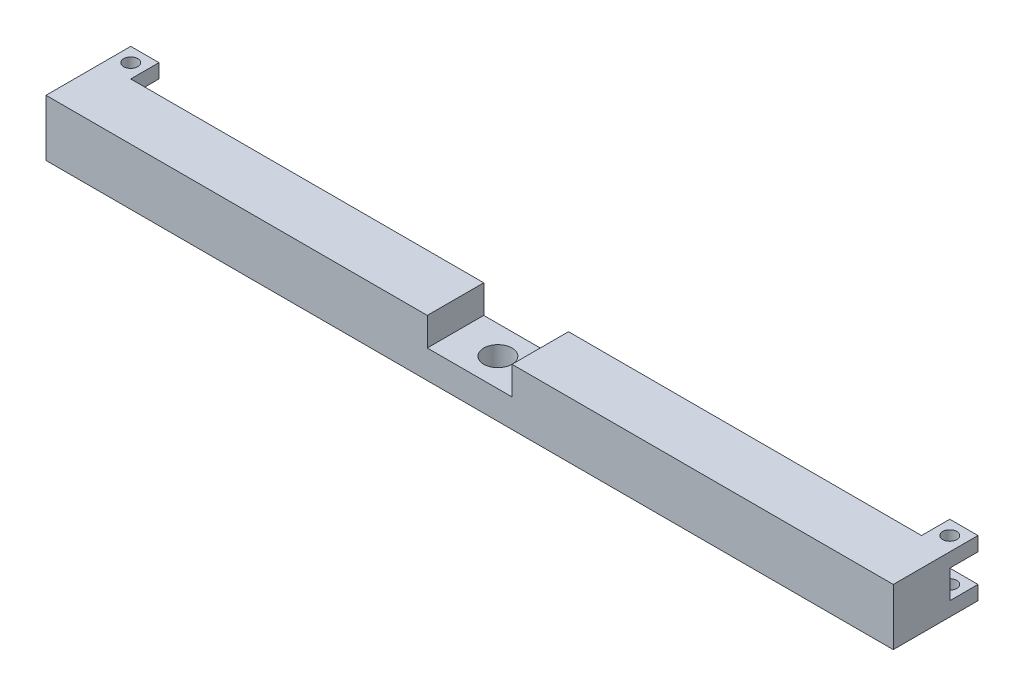
ISO-10303-21;
HEADER;
FILE_DESCRIPTION(('STEP AP214'),'2;1');
FILE_NAME('part.step','',(''),(''),'','','');
FILE_SCHEMA(('AUTOMOTIVE_DESIGN { 1 0 10303 214 1 1 1 1 }'));
ENDSEC;
DATA;
#1=APPLICATION_CONTEXT('core data for automotive mechanical design processes');
#2=APPLICATION_PROTOCOL_DEFINITION('international standard','automotive_design',2000,#1);
#3=PRODUCT_CONTEXT('',#1,'mechanical');
#4=PRODUCT('Part','Part','',(#3));
#5=PRODUCT_RELATED_PRODUCT_CATEGORY('part','',(#4));
#6=PRODUCT_DEFINITION_FORMATION('','',#4);
#7=PRODUCT_DEFINITION_CONTEXT('part definition',#1,'design');
#8=PRODUCT_DEFINITION('design','',#6,#7);
#9=PRODUCT_DEFINITION_SHAPE('','',#8);
#10=(LENGTH_UNIT() NAMED_UNIT(*) SI_UNIT(.MILLI.,.METRE.));
#11=(NAMED_UNIT(*) PLANE_ANGLE_UNIT() SI_UNIT($,.RADIAN.));
#12=(NAMED_UNIT(*) SI_UNIT($,.STERADIAN.) SOLID_ANGLE_UNIT());
#13=UNCERTAINTY_MEASURE_WITH_UNIT(LENGTH_MEASURE(1.E-05),#10,'distance_accuracy_value','');
#14=(GEOMETRIC_REPRESENTATION_CONTEXT(3) GLOBAL_UNCERTAINTY_ASSIGNED_CONTEXT((#13)) GLOBAL_UNIT_ASSIGNED_CONTEXT((#10,
#11,#12)) REPRESENTATION_CONTEXT('',''));
#15=CARTESIAN_POINT('',(0.,0.,0.));
#16=DIRECTION('',(0.,0.,1.));
#17=DIRECTION('',(1.,0.,0.));
#18=AXIS2_PLACEMENT_3D('',#15,#16,#17);
#19=CARTESIAN_POINT('',(0.,20.,0.));
#20=DIRECTION('',(0.,1.,0.));
#21=DIRECTION('',(0.,0.,1.));
#22=AXIS2_PLACEMENT_3D('',#19,#20,#21);
#23=PLANE('',#22);
#24=CARTESIAN_POINT('',(145.,20.,-15.));
#25=DIRECTION('',(0.,1.,0.));
#26=DIRECTION('',(0.,0.,1.));
#27=AXIS2_PLACEMENT_3D('',#24,#25,#26);
#28=CIRCLE('',#27,2.5);
#29=CARTESIAN_POINT('',(145.,20.,-12.5));
#30=VERTEX_POINT('',#29);
#31=EDGE_CURVE('E344',#30,#30,#28,.T.);
#32=ORIENTED_EDGE('',*,*,#31,.F.);
#33=EDGE_LOOP('',(#32));
#34=FACE_BOUND('',#33,.T.);
#35=DIRECTION('',(0.,0.,-1.));
#36=VECTOR('',#35,1.);
#37=CARTESIAN_POINT('',(15.,20.,-10.));
#38=LINE('',#37,#36);
#39=CARTESIAN_POINT('',(15.,20.,10.));
#40=VERTEX_POINT('',#39);
#41=CARTESIAN_POINT('',(15.,20.,-10.));
#42=VERTEX_POINT('',#41);
#43=EDGE_CURVE('E181',#40,#42,#38,.T.);
#44=ORIENTED_EDGE('',*,*,#43,.F.);
#45=DIRECTION('',(1.,0.,0.));
#46=VECTOR('',#45,1.);
#47=CARTESIAN_POINT('',(0.,20.,10.));
#48=LINE('',#47,#46);
#49=CARTESIAN_POINT('',(150.,20.,10.));
#50=VERTEX_POINT('',#49);
#51=EDGE_CURVE('E273',#40,#50,#48,.T.);
#52=ORIENTED_EDGE('',*,*,#51,.T.);
#53=DIRECTION('',(0.,0.,1.));
#54=VECTOR('',#53,1.);
#55=CARTESIAN_POINT('',(150.,20.,0.));
#56=LINE('',#55,#54);
#57=CARTESIAN_POINT('',(150.,20.,-20.));
#58=VERTEX_POINT('',#57);
#59=EDGE_CURVE('E254',#58,#50,#56,.T.);
#60=ORIENTED_EDGE('',*,*,#59,.F.);
#61=DIRECTION('',(-1.,0.,0.));
#62=VECTOR('',#61,1.);
#63=CARTESIAN_POINT('',(0.,20.,-20.));
#64=LINE('',#63,#62);
#65=CARTESIAN_POINT('',(140.,20.,-20.));
#66=VERTEX_POINT('',#65);
#67=EDGE_CURVE('E257',#58,#66,#64,.T.);
#68=ORIENTED_EDGE('',*,*,#67,.T.);
#69=DIRECTION('',(0.,0.,-1.));
#70=VECTOR('',#69,1.);
#71=CARTESIAN_POINT('',(140.,20.,0.));
#72=LINE('',#71,#70);
#73=CARTESIAN_POINT('',(140.,20.,-10.));
#74=VERTEX_POINT('',#73);
#75=EDGE_CURVE('E260',#74,#66,#72,.T.);
#76=ORIENTED_EDGE('',*,*,#75,.F.);
#77=DIRECTION('',(1.,0.,0.));
#78=VECTOR('',#77,1.);
#79=CARTESIAN_POINT('',(0.,20.,-10.));
#80=LINE('',#79,#78);
#81=EDGE_CURVE('E263',#42,#74,#80,.T.);
#82=ORIENTED_EDGE('',*,*,#81,.F.);
#83=EDGE_LOOP('',(#44,#52,#60,#68,#76,#82));
#84=FACE_BOUND('',#83,.T.);
#85=ADVANCED_FACE('F37',(#34,#84),#23,.T.);
#86=CARTESIAN_POINT('',(0.,20.,-20.));
#87=DIRECTION('',(0.,0.,1.));
#88=DIRECTION('',(1.,0.,0.));
#89=AXIS2_PLACEMENT_3D('',#86,#87,#88);
#90=PLANE('',#89);
#91=DIRECTION('',(0.,-1.,0.));
#92=VECTOR('',#91,1.);
#93=CARTESIAN_POINT('',(150.,20.,-20.));
#94=LINE('',#93,#92);
#95=CARTESIAN_POINT('',(150.,15.,-20.));
#96=VERTEX_POINT('',#95);
#97=EDGE_CURVE('E11',#58,#96,#94,.T.);
#98=ORIENTED_EDGE('',*,*,#97,.T.);
#99=DIRECTION('',(1.,0.,0.));
#100=VECTOR('',#99,1.);
#101=CARTESIAN_POINT('',(150.,15.,-20.));
#102=LINE('',#101,#100);
#103=CARTESIAN_POINT('',(140.,15.,-20.));
#104=VERTEX_POINT('',#103);
#105=EDGE_CURVE('E221',#104,#96,#102,.T.);
#106=ORIENTED_EDGE('',*,*,#105,.F.);
#107=DIRECTION('',(0.,-1.,0.));
#108=VECTOR('',#107,1.);
#109=CARTESIAN_POINT('',(140.,20.,-20.));
#110=LINE('',#109,#108);
#111=EDGE_CURVE('E320',#66,#104,#110,.T.);
#112=ORIENTED_EDGE('',*,*,#111,.F.);
#113=ORIENTED_EDGE('',*,*,#67,.F.);
#114=EDGE_LOOP('',(#98,#106,#112,#113));
#115=FACE_BOUND('',#114,.T.);
#116=ADVANCED_FACE('F372',(#115),#90,.F.);
#117=CARTESIAN_POINT('',(140.,20.,0.));
#118=DIRECTION('',(-1.,0.,0.));
#119=DIRECTION('',(0.,0.,1.));
#120=AXIS2_PLACEMENT_3D('',#117,#118,#119);
#121=PLANE('',#120);
#122=DIRECTION('',(0.,0.,-1.));
#123=VECTOR('',#122,1.);
#124=CARTESIAN_POINT('',(140.,15.,4.14213562373096));
#125=LINE('',#124,#123);
#126=CARTESIAN_POINT('',(140.,15.,-10.));
#127=VERTEX_POINT('',#126);
#128=EDGE_CURVE('E227',#127,#104,#125,.T.);
#129=ORIENTED_EDGE('',*,*,#128,.F.);
#130=DIRECTION('',(0.,-1.,0.));
#131=VECTOR('',#130,1.);
#132=CARTESIAN_POINT('',(140.,20.,-10.));
#133=LINE('',#132,#131);
#134=EDGE_CURVE('E316',#74,#127,#133,.T.);
#135=ORIENTED_EDGE('',*,*,#134,.F.);
#136=ORIENTED_EDGE('',*,*,#75,.T.);
#137=ORIENTED_EDGE('',*,*,#111,.T.);
#138=EDGE_LOOP('',(#129,#135,#136,#137));
#139=FACE_BOUND('',#138,.T.);
#140=ADVANCED_FACE('F379',(#139),#121,.T.);
#141=CARTESIAN_POINT('',(-140.,20.,0.));
#142=DIRECTION('',(-1.,0.,0.));
#143=DIRECTION('',(0.,0.,1.));
#144=AXIS2_PLACEMENT_3D('',#141,#142,#143);
#145=PLANE('',#144);
#146=DIRECTION('',(0.,-1.,0.));
#147=VECTOR('',#146,1.);
#148=CARTESIAN_POINT('',(-140.,20.,-10.));
#149=LINE('',#148,#147);
#150=CARTESIAN_POINT('',(-140.,20.,-10.));
#151=VERTEX_POINT('',#150);
#152=CARTESIAN_POINT('',(-140.,15.,-10.));
#153=VERTEX_POINT('',#152);
#154=EDGE_CURVE('E312',#151,#153,#149,.T.);
#155=ORIENTED_EDGE('',*,*,#154,.T.);
#156=DIRECTION('',(0.,0.,-1.));
#157=VECTOR('',#156,1.);
#158=CARTESIAN_POINT('',(-140.,15.,4.14213562373096));
#159=LINE('',#158,#157);
#160=CARTESIAN_POINT('',(-140.,15.,-20.));
#161=VERTEX_POINT('',#160);
#162=EDGE_CURVE('E245',#153,#161,#159,.T.);
#163=ORIENTED_EDGE('',*,*,#162,.T.);
#164=DIRECTION('',(0.,-1.,0.));
#165=VECTOR('',#164,1.);
#166=CARTESIAN_POINT('',(-140.,20.,-20.));
#167=LINE('',#166,#165);
#168=CARTESIAN_POINT('',(-140.,20.,-20.));
#169=VERTEX_POINT('',#168);
#170=EDGE_CURVE('E308',#169,#161,#167,.T.);
#171=ORIENTED_EDGE('',*,*,#170,.F.);
#172=DIRECTION('',(0.,0.,-1.));
#173=VECTOR('',#172,1.);
#174=CARTESIAN_POINT('',(-140.,20.,0.));
#175=LINE('',#174,#173);
#176=EDGE_CURVE('E266',#151,#169,#175,.T.);
#177=ORIENTED_EDGE('',*,*,#176,.F.);
#178=EDGE_LOOP('',(#155,#163,#171,#177));
#179=FACE_BOUND('',#178,.T.);
#180=ADVANCED_FACE('F408',(#179),#145,.F.);
#181=CARTESIAN_POINT('',(0.,20.,-20.));
#182=DIRECTION('',(0.,0.,-1.));
#183=DIRECTION('',(-1.,0.,0.));
#184=AXIS2_PLACEMENT_3D('',#181,#182,#183);
#185=PLANE('',#184);
#186=DIRECTION('',(1.,0.,0.));
#187=VECTOR('',#186,1.);
#188=CARTESIAN_POINT('',(-150.,15.,-20.));
#189=LINE('',#188,#187);
#190=CARTESIAN_POINT('',(-150.,15.,-20.));
#191=VERTEX_POINT('',#190);
#192=EDGE_CURVE('E208',#191,#161,#189,.T.);
#193=ORIENTED_EDGE('',*,*,#192,.F.);
#194=DIRECTION('',(0.,-1.,0.));
#195=VECTOR('',#194,1.);
#196=CARTESIAN_POINT('',(-150.,20.,-20.));
#197=LINE('',#196,#195);
#198=CARTESIAN_POINT('',(-150.,20.,-20.));
#199=VERTEX_POINT('',#198);
#200=EDGE_CURVE('E304',#199,#191,#197,.T.);
#201=ORIENTED_EDGE('',*,*,#200,.F.);
#202=DIRECTION('',(1.,0.,0.));
#203=VECTOR('',#202,1.);
#204=CARTESIAN_POINT('',(0.,20.,-20.));
#205=LINE('',#204,#203);
#206=EDGE_CURVE('E268',#199,#169,#205,.T.);
#207=ORIENTED_EDGE('',*,*,#206,.T.);
#208=ORIENTED_EDGE('',*,*,#170,.T.);
#209=EDGE_LOOP('',(#193,#201,#207,#208));
#210=FACE_BOUND('',#209,.T.);
#211=ADVANCED_FACE('F414',(#210),#185,.T.);
#212=CARTESIAN_POINT('',(150.,20.,0.));
#213=DIRECTION('',(1.,0.,0.));
#214=DIRECTION('',(0.,0.,-1.));
#215=AXIS2_PLACEMENT_3D('',#212,#213,#214);
#216=PLANE('',#215);
#217=DIRECTION('',(0.,0.,-1.));
#218=VECTOR('',#217,1.);
#219=CARTESIAN_POINT('',(150.,15.,4.14213562373096));
#220=LINE('',#219,#218);
#221=CARTESIAN_POINT('',(150.,15.,-10.));
#222=VERTEX_POINT('',#221);
#223=EDGE_CURVE('E216',#222,#96,#220,.T.);
#224=ORIENTED_EDGE('',*,*,#223,.T.);
#225=ORIENTED_EDGE('',*,*,#97,.F.);
#226=ORIENTED_EDGE('',*,*,#59,.T.);
#227=DIRECTION('',(0.,-1.,0.));
#228=VECTOR('',#227,1.);
#229=CARTESIAN_POINT('',(150.,20.,10.));
#230=LINE('',#229,#228);
#231=CARTESIAN_POINT('',(150.,0.,10.));
#232=VERTEX_POINT('',#231);
#233=EDGE_CURVE('E277',#50,#232,#230,.T.);
#234=ORIENTED_EDGE('',*,*,#233,.T.);
#235=DIRECTION('',(0.,0.,1.));
#236=VECTOR('',#235,1.);
#237=CARTESIAN_POINT('',(150.,0.,0.));
#238=LINE('',#237,#236);
#239=CARTESIAN_POINT('',(150.,0.,-20.));
#240=VERTEX_POINT('',#239);
#241=EDGE_CURVE('E234',#240,#232,#238,.T.);
#242=ORIENTED_EDGE('',*,*,#241,.F.);
#243=CARTESIAN_POINT('',(150.,5.,-20.));
#244=VERTEX_POINT('',#243);
#245=EDGE_CURVE('E46',#244,#240,#94,.T.);
#246=ORIENTED_EDGE('',*,*,#245,.F.);
#247=DIRECTION('',(0.,0.,-1.));
#248=VECTOR('',#247,1.);
#249=CARTESIAN_POINT('',(150.,5.,4.14213562373096));
#250=LINE('',#249,#248);
#251=CARTESIAN_POINT('',(150.,5.,-10.));
#252=VERTEX_POINT('',#251);
#253=EDGE_CURVE('E224',#252,#244,#250,.T.);
#254=ORIENTED_EDGE('',*,*,#253,.F.);
#255=DIRECTION('',(0.,1.,0.));
#256=VECTOR('',#255,1.);
#257=CARTESIAN_POINT('',(150.,15.,-10.));
#258=LINE('',#257,#256);
#259=EDGE_CURVE('E215',#252,#222,#258,.T.);
#260=ORIENTED_EDGE('',*,*,#259,.T.);
#261=EDGE_LOOP('',(#224,#225,#226,#234,#242,#246,#254,#260));
#262=FACE_BOUND('',#261,.T.);
#263=ADVANCED_FACE('F39',(#262),#216,.T.);
#264=CARTESIAN_POINT('',(140.,5.,-20.));
#265=VERTEX_POINT('',#264);
#266=CARTESIAN_POINT('',(140.,0.,-20.));
#267=VERTEX_POINT('',#266);
#268=EDGE_CURVE('E319',#265,#267,#110,.T.);
#269=ORIENTED_EDGE('',*,*,#268,.F.);
#270=DIRECTION('',(-1.,0.,0.));
#271=VECTOR('',#270,1.);
#272=CARTESIAN_POINT('',(150.,5.,-20.));
#273=LINE('',#272,#271);
#274=EDGE_CURVE('E219',#244,#265,#273,.T.);
#275=ORIENTED_EDGE('',*,*,#274,.F.);
#276=ORIENTED_EDGE('',*,*,#245,.T.);
#277=DIRECTION('',(-1.,0.,0.));
#278=VECTOR('',#277,1.);
#279=CARTESIAN_POINT('',(0.,0.,-20.));
#280=LINE('',#279,#278);
#281=EDGE_CURVE('E280',#240,#267,#280,.T.);
#282=ORIENTED_EDGE('',*,*,#281,.T.);
#283=EDGE_LOOP('',(#269,#275,#276,#282));
#284=FACE_BOUND('',#283,.T.);
#285=ADVANCED_FACE('F381',(#284),#90,.F.);
#286=DIRECTION('',(0.,0.,-1.));
#287=VECTOR('',#286,1.);
#288=CARTESIAN_POINT('',(140.,5.,4.14213562373096));
#289=LINE('',#288,#287);
#290=CARTESIAN_POINT('',(140.,5.,-10.));
#291=VERTEX_POINT('',#290);
#292=EDGE_CURVE('E229',#291,#265,#289,.T.);
#293=ORIENTED_EDGE('',*,*,#292,.T.);
#294=ORIENTED_EDGE('',*,*,#268,.T.);
#295=DIRECTION('',(0.,0.,-1.));
#296=VECTOR('',#295,1.);
#297=CARTESIAN_POINT('',(140.,0.,0.));
#298=LINE('',#297,#296);
#299=CARTESIAN_POINT('',(140.,0.,-10.));
#300=VERTEX_POINT('',#299);
#301=EDGE_CURVE('E283',#300,#267,#298,.T.);
#302=ORIENTED_EDGE('',*,*,#301,.F.);
#303=EDGE_CURVE('E315',#291,#300,#133,.T.);
#304=ORIENTED_EDGE('',*,*,#303,.F.);
#305=EDGE_LOOP('',(#293,#294,#302,#304));
#306=FACE_BOUND('',#305,.T.);
#307=ADVANCED_FACE('F476',(#306),#121,.T.);
#308=CARTESIAN_POINT('',(0.,20.,-10.));
#309=DIRECTION('',(0.,0.,-1.));
#310=DIRECTION('',(-1.,0.,0.));
#311=AXIS2_PLACEMENT_3D('',#308,#309,#310);
#312=PLANE('',#311);
#313=DIRECTION('',(0.,1.,0.));
#314=VECTOR('',#313,1.);
#315=CARTESIAN_POINT('',(15.,10.,-10.));
#316=LINE('',#315,#314);
#317=CARTESIAN_POINT('',(15.,10.,-10.));
#318=VERTEX_POINT('',#317);
#319=EDGE_CURVE('E175',#318,#42,#316,.T.);
#320=ORIENTED_EDGE('',*,*,#319,.T.);
#321=ORIENTED_EDGE('',*,*,#81,.T.);
#322=ORIENTED_EDGE('',*,*,#134,.T.);
#323=DIRECTION('',(-1.,0.,0.));
#324=VECTOR('',#323,1.);
#325=CARTESIAN_POINT('',(150.,15.,-10.));
#326=LINE('',#325,#324);
#327=EDGE_CURVE('E213',#222,#127,#326,.T.);
#328=ORIENTED_EDGE('',*,*,#327,.F.);
#329=ORIENTED_EDGE('',*,*,#259,.F.);
#330=DIRECTION('',(1.,0.,0.));
#331=VECTOR('',#330,1.);
#332=CARTESIAN_POINT('',(150.,5.,-10.));
#333=LINE('',#332,#331);
#334=EDGE_CURVE('E62',#291,#252,#333,.T.);
#335=ORIENTED_EDGE('',*,*,#334,.F.);
#336=ORIENTED_EDGE('',*,*,#303,.T.);
#337=DIRECTION('',(1.,0.,0.));
#338=VECTOR('',#337,1.);
#339=CARTESIAN_POINT('',(0.,0.,-10.));
#340=LINE('',#339,#338);
#341=CARTESIAN_POINT('',(-140.,0.,-10.));
#342=VERTEX_POINT('',#341);
#343=EDGE_CURVE('E286',#342,#300,#340,.T.);
#344=ORIENTED_EDGE('',*,*,#343,.F.);
#345=CARTESIAN_POINT('',(-140.,5.,-10.));
#346=VERTEX_POINT('',#345);
#347=EDGE_CURVE('E311',#346,#342,#149,.T.);
#348=ORIENTED_EDGE('',*,*,#347,.F.);
#349=DIRECTION('',(1.,0.,0.));
#350=VECTOR('',#349,1.);
#351=CARTESIAN_POINT('',(-150.,5.,-10.));
#352=LINE('',#351,#350);
#353=CARTESIAN_POINT('',(-150.,5.,-10.));
#354=VERTEX_POINT('',#353);
#355=EDGE_CURVE('E235',#354,#346,#352,.T.);
#356=ORIENTED_EDGE('',*,*,#355,.F.);
#357=DIRECTION('',(0.,-1.,0.));
#358=VECTOR('',#357,1.);
#359=CARTESIAN_POINT('',(-150.,15.,-10.));
#360=LINE('',#359,#358);
#361=CARTESIAN_POINT('',(-150.,15.,-10.));
#362=VERTEX_POINT('',#361);
#363=EDGE_CURVE('E237',#362,#354,#360,.T.);
#364=ORIENTED_EDGE('',*,*,#363,.F.);
#365=DIRECTION('',(-1.,0.,0.));
#366=VECTOR('',#365,1.);
#367=CARTESIAN_POINT('',(-150.,15.,-10.));
#368=LINE('',#367,#366);
#369=EDGE_CURVE('E222',#153,#362,#368,.T.);
#370=ORIENTED_EDGE('',*,*,#369,.F.);
#371=ORIENTED_EDGE('',*,*,#154,.F.);
#372=CARTESIAN_POINT('',(-15.,20.,-10.));
#373=VERTEX_POINT('',#372);
#374=EDGE_CURVE('E264',#151,#373,#80,.T.);
#375=ORIENTED_EDGE('',*,*,#374,.T.);
#376=DIRECTION('',(0.,1.,0.));
#377=VECTOR('',#376,1.);
#378=CARTESIAN_POINT('',(-15.,10.,-10.));
#379=LINE('',#378,#377);
#380=CARTESIAN_POINT('',(-15.,10.,-10.));
#381=VERTEX_POINT('',#380);
#382=EDGE_CURVE('E54',#381,#373,#379,.T.);
#383=ORIENTED_EDGE('',*,*,#382,.F.);
#384=DIRECTION('',(-1.,0.,0.));
#385=VECTOR('',#384,1.);
#386=CARTESIAN_POINT('',(-15.,10.,-10.));
#387=LINE('',#386,#385);
#388=EDGE_CURVE('E190',#318,#381,#387,.T.);
#389=ORIENTED_EDGE('',*,*,#388,.F.);
#390=EDGE_LOOP('',(#320,#321,#322,#328,#329,#335,#336,#344,#348,#356,#364,#370,#371,#375,#383,#389));
#391=FACE_BOUND('',#390,.T.);
#392=ADVANCED_FACE('F195',(#391),#312,.T.);
#393=CARTESIAN_POINT('',(-140.,5.,-20.));
#394=VERTEX_POINT('',#393);
#395=CARTESIAN_POINT('',(-140.,0.,-20.));
#396=VERTEX_POINT('',#395);
#397=EDGE_CURVE('E307',#394,#396,#167,.T.);
#398=ORIENTED_EDGE('',*,*,#397,.F.);
#399=DIRECTION('',(0.,0.,-1.));
#400=VECTOR('',#399,1.);
#401=CARTESIAN_POINT('',(-140.,5.,4.14213562373096));
#402=LINE('',#401,#400);
#403=EDGE_CURVE('E250',#346,#394,#402,.T.);
#404=ORIENTED_EDGE('',*,*,#403,.F.);
#405=ORIENTED_EDGE('',*,*,#347,.T.);
#406=DIRECTION('',(0.,0.,-1.));
#407=VECTOR('',#406,1.);
#408=CARTESIAN_POINT('',(-140.,0.,0.));
#409=LINE('',#408,#407);
#410=EDGE_CURVE('E289',#342,#396,#409,.T.);
#411=ORIENTED_EDGE('',*,*,#410,.T.);
#412=EDGE_LOOP('',(#398,#404,#405,#411));
#413=FACE_BOUND('',#412,.T.);
#414=ADVANCED_FACE('F480',(#413),#145,.F.);
#415=DIRECTION('',(-1.,0.,0.));
#416=VECTOR('',#415,1.);
#417=CARTESIAN_POINT('',(-150.,5.,-20.));
#418=LINE('',#417,#416);
#419=CARTESIAN_POINT('',(-150.,5.,-20.));
#420=VERTEX_POINT('',#419);
#421=EDGE_CURVE('E243',#394,#420,#418,.T.);
#422=ORIENTED_EDGE('',*,*,#421,.F.);
#423=ORIENTED_EDGE('',*,*,#397,.T.);
#424=DIRECTION('',(1.,0.,0.));
#425=VECTOR('',#424,1.);
#426=CARTESIAN_POINT('',(0.,0.,-20.));
#427=LINE('',#426,#425);
#428=CARTESIAN_POINT('',(-150.,0.,-20.));
#429=VERTEX_POINT('',#428);
#430=EDGE_CURVE('E292',#429,#396,#427,.T.);
#431=ORIENTED_EDGE('',*,*,#430,.F.);
#432=EDGE_CURVE('E303',#420,#429,#197,.T.);
#433=ORIENTED_EDGE('',*,*,#432,.F.);
#434=EDGE_LOOP('',(#422,#423,#431,#433));
#435=FACE_BOUND('',#434,.T.);
#436=ADVANCED_FACE('F449',(#435),#185,.T.);
#437=CARTESIAN_POINT('',(-150.,20.,0.));
#438=DIRECTION('',(1.,0.,0.));
#439=DIRECTION('',(0.,0.,-1.));
#440=AXIS2_PLACEMENT_3D('',#437,#438,#439);
#441=PLANE('',#440);
#442=ORIENTED_EDGE('',*,*,#200,.T.);
#443=DIRECTION('',(0.,0.,-1.));
#444=VECTOR('',#443,1.);
#445=CARTESIAN_POINT('',(-150.,15.,4.14213562373096));
#446=LINE('',#445,#444);
#447=EDGE_CURVE('E238',#362,#191,#446,.T.);
#448=ORIENTED_EDGE('',*,*,#447,.F.);
#449=ORIENTED_EDGE('',*,*,#363,.T.);
#450=DIRECTION('',(0.,0.,-1.));
#451=VECTOR('',#450,1.);
#452=CARTESIAN_POINT('',(-150.,5.,4.14213562373096));
#453=LINE('',#452,#451);
#454=EDGE_CURVE('E247',#354,#420,#453,.T.);
#455=ORIENTED_EDGE('',*,*,#454,.T.);
#456=ORIENTED_EDGE('',*,*,#432,.T.);
#457=DIRECTION('',(0.,0.,1.));
#458=VECTOR('',#457,1.);
#459=CARTESIAN_POINT('',(-150.,0.,0.));
#460=LINE('',#459,#458);
#461=CARTESIAN_POINT('',(-150.,0.,10.));
#462=VERTEX_POINT('',#461);
#463=EDGE_CURVE('E295',#429,#462,#460,.T.);
#464=ORIENTED_EDGE('',*,*,#463,.T.);
#465=DIRECTION('',(0.,-1.,0.));
#466=VECTOR('',#465,1.);
#467=CARTESIAN_POINT('',(-150.,20.,10.));
#468=LINE('',#467,#466);
#469=CARTESIAN_POINT('',(-150.,20.,10.));
#470=VERTEX_POINT('',#469);
#471=EDGE_CURVE('E300',#470,#462,#468,.T.);
#472=ORIENTED_EDGE('',*,*,#471,.F.);
#473=DIRECTION('',(0.,0.,1.));
#474=VECTOR('',#473,1.);
#475=CARTESIAN_POINT('',(-150.,20.,0.));
#476=LINE('',#475,#474);
#477=EDGE_CURVE('E271',#199,#470,#476,.T.);
#478=ORIENTED_EDGE('',*,*,#477,.F.);
#479=EDGE_LOOP('',(#442,#448,#449,#455,#456,#464,#472,#478));
#480=FACE_BOUND('',#479,.T.);
#481=ADVANCED_FACE('F396',(#480),#441,.F.);
#482=CARTESIAN_POINT('',(0.,20.,10.));
#483=DIRECTION('',(0.,0.,-1.));
#484=DIRECTION('',(-1.,0.,0.));
#485=AXIS2_PLACEMENT_3D('',#482,#483,#484);
#486=PLANE('',#485);
#487=ORIENTED_EDGE('',*,*,#51,.F.);
#488=DIRECTION('',(0.,1.,0.));
#489=VECTOR('',#488,1.);
#490=CARTESIAN_POINT('',(15.,10.,10.));
#491=LINE('',#490,#489);
#492=CARTESIAN_POINT('',(15.,10.,10.));
#493=VERTEX_POINT('',#492);
#494=EDGE_CURVE('E206',#493,#40,#491,.T.);
#495=ORIENTED_EDGE('',*,*,#494,.F.);
#496=DIRECTION('',(1.,0.,0.));
#497=VECTOR('',#496,1.);
#498=CARTESIAN_POINT('',(-15.,10.,10.));
#499=LINE('',#498,#497);
#500=CARTESIAN_POINT('',(-15.,10.,10.));
#501=VERTEX_POINT('',#500);
#502=EDGE_CURVE('E184',#501,#493,#499,.T.);
#503=ORIENTED_EDGE('',*,*,#502,.F.);
#504=DIRECTION('',(0.,1.,0.));
#505=VECTOR('',#504,1.);
#506=CARTESIAN_POINT('',(-15.,10.,10.));
#507=LINE('',#506,#505);
#508=CARTESIAN_POINT('',(-15.,20.,10.));
#509=VERTEX_POINT('',#508);
#510=EDGE_CURVE('E209',#501,#509,#507,.T.);
#511=ORIENTED_EDGE('',*,*,#510,.T.);
#512=EDGE_CURVE('E274',#470,#509,#48,.T.);
#513=ORIENTED_EDGE('',*,*,#512,.F.);
#514=ORIENTED_EDGE('',*,*,#471,.T.);
#515=DIRECTION('',(1.,0.,0.));
#516=VECTOR('',#515,1.);
#517=CARTESIAN_POINT('',(0.,0.,10.));
#518=LINE('',#517,#516);
#519=EDGE_CURVE('E258',#462,#232,#518,.T.);
#520=ORIENTED_EDGE('',*,*,#519,.T.);
#521=ORIENTED_EDGE('',*,*,#233,.F.);
#522=EDGE_LOOP('',(#487,#495,#503,#511,#513,#514,#520,#521));
#523=FACE_BOUND('',#522,.T.);
#524=ADVANCED_FACE('F388',(#523),#486,.F.);
#525=CARTESIAN_POINT('',(-145.,20.,-15.));
#526=DIRECTION('',(0.,1.,0.));
#527=DIRECTION('',(0.,0.,-1.));
#528=AXIS2_PLACEMENT_3D('',#525,#526,#527);
#529=CIRCLE('',#528,2.5);
#530=CARTESIAN_POINT('',(-145.,20.,-17.5));
#531=VERTEX_POINT('',#530);
#532=EDGE_CURVE('E331',#531,#531,#529,.T.);
#533=ORIENTED_EDGE('',*,*,#532,.F.);
#534=EDGE_LOOP('',(#533));
#535=FACE_BOUND('',#534,.T.);
#536=DIRECTION('',(0.,0.,1.));
#537=VECTOR('',#536,1.);
#538=CARTESIAN_POINT('',(-15.,20.,-10.));
#539=LINE('',#538,#537);
#540=EDGE_CURVE('E193',#373,#509,#539,.T.);
#541=ORIENTED_EDGE('',*,*,#540,.F.);
#542=ORIENTED_EDGE('',*,*,#374,.F.);
#543=ORIENTED_EDGE('',*,*,#176,.T.);
#544=ORIENTED_EDGE('',*,*,#206,.F.);
#545=ORIENTED_EDGE('',*,*,#477,.T.);
#546=ORIENTED_EDGE('',*,*,#512,.T.);
#547=EDGE_LOOP('',(#541,#542,#543,#544,#545,#546));
#548=FACE_BOUND('',#547,.T.);
#549=ADVANCED_FACE('F375',(#535,#548),#23,.T.);
#550=CARTESIAN_POINT('',(0.,0.,0.));
#551=DIRECTION('',(0.,1.,0.));
#552=DIRECTION('',(0.,0.,1.));
#553=AXIS2_PLACEMENT_3D('',#550,#551,#552);
#554=PLANE('',#553);
#555=CARTESIAN_POINT('',(0.,0.,0.));
#556=DIRECTION('',(0.,1.,0.));
#557=DIRECTION('',(0.,0.,1.));
#558=AXIS2_PLACEMENT_3D('',#555,#556,#557);
#559=CIRCLE('',#558,5.);
#560=CARTESIAN_POINT('',(0.,0.,5.));
#561=VERTEX_POINT('',#560);
#562=EDGE_CURVE('E339',#561,#561,#559,.F.);
#563=ORIENTED_EDGE('',*,*,#562,.F.);
#564=EDGE_LOOP('',(#563));
#565=FACE_BOUND('',#564,.T.);
#566=CARTESIAN_POINT('',(-145.,0.,-15.));
#567=DIRECTION('',(0.,1.,0.));
#568=DIRECTION('',(0.,0.,-1.));
#569=AXIS2_PLACEMENT_3D('',#566,#567,#568);
#570=CIRCLE('',#569,2.5);
#571=CARTESIAN_POINT('',(-145.,0.,-17.5));
#572=VERTEX_POINT('',#571);
#573=EDGE_CURVE('E325',#572,#572,#570,.T.);
#574=ORIENTED_EDGE('',*,*,#573,.T.);
#575=EDGE_LOOP('',(#574));
#576=FACE_BOUND('',#575,.T.);
#577=CARTESIAN_POINT('',(145.,0.,-15.));
#578=DIRECTION('',(0.,1.,0.));
#579=DIRECTION('',(0.,0.,1.));
#580=AXIS2_PLACEMENT_3D('',#577,#578,#579);
#581=CIRCLE('',#580,2.5);
#582=CARTESIAN_POINT('',(145.,0.,-12.5));
#583=VERTEX_POINT('',#582);
#584=EDGE_CURVE('E336',#583,#583,#581,.T.);
#585=ORIENTED_EDGE('',*,*,#584,.T.);
#586=EDGE_LOOP('',(#585));
#587=FACE_BOUND('',#586,.T.);
#588=ORIENTED_EDGE('',*,*,#241,.T.);
#589=ORIENTED_EDGE('',*,*,#519,.F.);
#590=ORIENTED_EDGE('',*,*,#463,.F.);
#591=ORIENTED_EDGE('',*,*,#430,.T.);
#592=ORIENTED_EDGE('',*,*,#410,.F.);
#593=ORIENTED_EDGE('',*,*,#343,.T.);
#594=ORIENTED_EDGE('',*,*,#301,.T.);
#595=ORIENTED_EDGE('',*,*,#281,.F.);
#596=EDGE_LOOP('',(#588,#589,#590,#591,#592,#593,#594,#595));
#597=FACE_BOUND('',#596,.T.);
#598=ADVANCED_FACE('F387',(#565,#576,#587,#597),#554,.F.);
#599=CARTESIAN_POINT('',(-150.,15.,4.14213562373096));
#600=DIRECTION('',(0.,1.,0.));
#601=DIRECTION('',(0.,0.,1.));
#602=AXIS2_PLACEMENT_3D('',#599,#600,#601);
#603=PLANE('',#602);
#604=CARTESIAN_POINT('',(-145.,15.,-15.));
#605=DIRECTION('',(0.,1.,0.));
#606=DIRECTION('',(0.,0.,1.));
#607=AXIS2_PLACEMENT_3D('',#604,#605,#606);
#608=CIRCLE('',#607,2.5);
#609=CARTESIAN_POINT('',(-145.,15.,-12.5));
#610=VERTEX_POINT('',#609);
#611=EDGE_CURVE('E204',#610,#610,#608,.T.);
#612=ORIENTED_EDGE('',*,*,#611,.T.);
#613=EDGE_LOOP('',(#612));
#614=FACE_BOUND('',#613,.T.);
#615=ORIENTED_EDGE('',*,*,#369,.T.);
#616=ORIENTED_EDGE('',*,*,#447,.T.);
#617=ORIENTED_EDGE('',*,*,#192,.T.);
#618=ORIENTED_EDGE('',*,*,#162,.F.);
#619=EDGE_LOOP('',(#615,#616,#617,#618));
#620=FACE_BOUND('',#619,.T.);
#621=ADVANCED_FACE('F394',(#614,#620),#603,.F.);
#622=CARTESIAN_POINT('',(-150.,5.,4.14213562373096));
#623=DIRECTION('',(0.,-1.,0.));
#624=DIRECTION('',(0.,0.,-1.));
#625=AXIS2_PLACEMENT_3D('',#622,#623,#624);
#626=PLANE('',#625);
#627=CARTESIAN_POINT('',(-145.,5.,-15.));
#628=DIRECTION('',(0.,-1.,0.));
#629=DIRECTION('',(0.,0.,-1.));
#630=AXIS2_PLACEMENT_3D('',#627,#628,#629);
#631=CIRCLE('',#630,2.5);
#632=CARTESIAN_POINT('',(-145.,5.,-17.5));
#633=VERTEX_POINT('',#632);
#634=EDGE_CURVE('E41',#633,#633,#631,.T.);
#635=ORIENTED_EDGE('',*,*,#634,.T.);
#636=EDGE_LOOP('',(#635));
#637=FACE_BOUND('',#636,.T.);
#638=ORIENTED_EDGE('',*,*,#355,.T.);
#639=ORIENTED_EDGE('',*,*,#403,.T.);
#640=ORIENTED_EDGE('',*,*,#421,.T.);
#641=ORIENTED_EDGE('',*,*,#454,.F.);
#642=EDGE_LOOP('',(#638,#639,#640,#641));
#643=FACE_BOUND('',#642,.T.);
#644=ADVANCED_FACE('F352',(#637,#643),#626,.F.);
#645=CARTESIAN_POINT('',(150.,15.,4.14213562373096));
#646=DIRECTION('',(0.,1.,0.));
#647=DIRECTION('',(0.,0.,1.));
#648=AXIS2_PLACEMENT_3D('',#645,#646,#647);
#649=PLANE('',#648);
#650=CARTESIAN_POINT('',(145.,15.,-15.));
#651=DIRECTION('',(0.,1.,0.));
#652=DIRECTION('',(0.,0.,1.));
#653=AXIS2_PLACEMENT_3D('',#650,#651,#652);
#654=CIRCLE('',#653,2.5);
#655=CARTESIAN_POINT('',(145.,15.,-12.5));
#656=VERTEX_POINT('',#655);
#657=EDGE_CURVE('E324',#656,#656,#654,.T.);
#658=ORIENTED_EDGE('',*,*,#657,.T.);
#659=EDGE_LOOP('',(#658));
#660=FACE_BOUND('',#659,.T.);
#661=ORIENTED_EDGE('',*,*,#327,.T.);
#662=ORIENTED_EDGE('',*,*,#128,.T.);
#663=ORIENTED_EDGE('',*,*,#105,.T.);
#664=ORIENTED_EDGE('',*,*,#223,.F.);
#665=EDGE_LOOP('',(#661,#662,#663,#664));
#666=FACE_BOUND('',#665,.T.);
#667=ADVANCED_FACE('F432',(#660,#666),#649,.F.);
#668=CARTESIAN_POINT('',(150.,5.,4.14213562373096));
#669=DIRECTION('',(0.,-1.,0.));
#670=DIRECTION('',(0.,0.,-1.));
#671=AXIS2_PLACEMENT_3D('',#668,#669,#670);
#672=PLANE('',#671);
#673=CARTESIAN_POINT('',(145.,5.,-15.));
#674=DIRECTION('',(0.,-1.,0.));
#675=DIRECTION('',(0.,0.,-1.));
#676=AXIS2_PLACEMENT_3D('',#673,#674,#675);
#677=CIRCLE('',#676,2.5);
#678=CARTESIAN_POINT('',(145.,5.,-17.5));
#679=VERTEX_POINT('',#678);
#680=EDGE_CURVE('E322',#679,#679,#677,.T.);
#681=ORIENTED_EDGE('',*,*,#680,.T.);
#682=EDGE_LOOP('',(#681));
#683=FACE_BOUND('',#682,.T.);
#684=ORIENTED_EDGE('',*,*,#334,.T.);
#685=ORIENTED_EDGE('',*,*,#253,.T.);
#686=ORIENTED_EDGE('',*,*,#274,.T.);
#687=ORIENTED_EDGE('',*,*,#292,.F.);
#688=EDGE_LOOP('',(#684,#685,#686,#687));
#689=FACE_BOUND('',#688,.T.);
#690=ADVANCED_FACE('F429',(#683,#689),#672,.F.);
#691=CARTESIAN_POINT('',(15.,10.,-10.));
#692=DIRECTION('',(1.,0.,0.));
#693=DIRECTION('',(0.,0.,-1.));
#694=AXIS2_PLACEMENT_3D('',#691,#692,#693);
#695=PLANE('',#694);
#696=ORIENTED_EDGE('',*,*,#43,.T.);
#697=ORIENTED_EDGE('',*,*,#319,.F.);
#698=DIRECTION('',(0.,0.,-1.));
#699=VECTOR('',#698,1.);
#700=CARTESIAN_POINT('',(15.,10.,-10.));
#701=LINE('',#700,#699);
#702=EDGE_CURVE('E178',#493,#318,#701,.T.);
#703=ORIENTED_EDGE('',*,*,#702,.F.);
#704=ORIENTED_EDGE('',*,*,#494,.T.);
#705=EDGE_LOOP('',(#696,#697,#703,#704));
#706=FACE_BOUND('',#705,.T.);
#707=ADVANCED_FACE('F177',(#706),#695,.F.);
#708=CARTESIAN_POINT('',(-15.,10.,-10.));
#709=DIRECTION('',(-1.,0.,0.));
#710=DIRECTION('',(0.,0.,1.));
#711=AXIS2_PLACEMENT_3D('',#708,#709,#710);
#712=PLANE('',#711);
#713=ORIENTED_EDGE('',*,*,#540,.T.);
#714=ORIENTED_EDGE('',*,*,#510,.F.);
#715=DIRECTION('',(0.,0.,1.));
#716=VECTOR('',#715,1.);
#717=CARTESIAN_POINT('',(-15.,10.,-10.));
#718=LINE('',#717,#716);
#719=EDGE_CURVE('E197',#381,#501,#718,.T.);
#720=ORIENTED_EDGE('',*,*,#719,.F.);
#721=ORIENTED_EDGE('',*,*,#382,.T.);
#722=EDGE_LOOP('',(#713,#714,#720,#721));
#723=FACE_BOUND('',#722,.T.);
#724=ADVANCED_FACE('F420',(#723),#712,.F.);
#725=CARTESIAN_POINT('',(0.,10.,0.));
#726=DIRECTION('',(0.,1.,0.));
#727=DIRECTION('',(0.,0.,1.));
#728=AXIS2_PLACEMENT_3D('',#725,#726,#727);
#729=PLANE('',#728);
#730=CARTESIAN_POINT('',(0.,10.,0.));
#731=DIRECTION('',(0.,1.,0.));
#732=DIRECTION('',(0.,0.,1.));
#733=AXIS2_PLACEMENT_3D('',#730,#731,#732);
#734=CIRCLE('',#733,5.);
#735=CARTESIAN_POINT('',(0.,10.,5.));
#736=VERTEX_POINT('',#735);
#737=EDGE_CURVE('E618',#736,#736,#734,.T.);
#738=ORIENTED_EDGE('',*,*,#737,.F.);
#739=EDGE_LOOP('',(#738));
#740=FACE_BOUND('',#739,.T.);
#741=ORIENTED_EDGE('',*,*,#702,.T.);
#742=ORIENTED_EDGE('',*,*,#388,.T.);
#743=ORIENTED_EDGE('',*,*,#719,.T.);
#744=ORIENTED_EDGE('',*,*,#502,.T.);
#745=EDGE_LOOP('',(#741,#742,#743,#744));
#746=FACE_BOUND('',#745,.T.);
#747=ADVANCED_FACE('F188',(#740,#746),#729,.T.);
#748=CARTESIAN_POINT('',(145.,0.,-15.));
#749=DIRECTION('',(0.,1.,0.));
#750=DIRECTION('',(0.,0.,1.));
#751=AXIS2_PLACEMENT_3D('',#748,#749,#750);
#752=CYLINDRICAL_SURFACE('',#751,2.5);
#753=ORIENTED_EDGE('',*,*,#584,.F.);
#754=EDGE_LOOP('',(#753));
#755=FACE_BOUND('',#754,.T.);
#756=ORIENTED_EDGE('',*,*,#680,.F.);
#757=EDGE_LOOP('',(#756));
#758=FACE_BOUND('',#757,.T.);
#759=ADVANCED_FACE('F367',(#755,#758),#752,.F.);
#760=ORIENTED_EDGE('',*,*,#31,.T.);
#761=EDGE_LOOP('',(#760));
#762=FACE_BOUND('',#761,.T.);
#763=ORIENTED_EDGE('',*,*,#657,.F.);
#764=EDGE_LOOP('',(#763));
#765=FACE_BOUND('',#764,.T.);
#766=ADVANCED_FACE('F358',(#762,#765),#752,.F.);
#767=CARTESIAN_POINT('',(-145.,0.,-15.));
#768=DIRECTION('',(0.,1.,0.));
#769=DIRECTION('',(0.,0.,1.));
#770=AXIS2_PLACEMENT_3D('',#767,#768,#769);
#771=CYLINDRICAL_SURFACE('',#770,2.5);
#772=ORIENTED_EDGE('',*,*,#573,.F.);
#773=EDGE_LOOP('',(#772));
#774=FACE_BOUND('',#773,.T.);
#775=ORIENTED_EDGE('',*,*,#634,.F.);
#776=EDGE_LOOP('',(#775));
#777=FACE_BOUND('',#776,.T.);
#778=ADVANCED_FACE('F355',(#774,#777),#771,.F.);
#779=ORIENTED_EDGE('',*,*,#532,.T.);
#780=EDGE_LOOP('',(#779));
#781=FACE_BOUND('',#780,.T.);
#782=ORIENTED_EDGE('',*,*,#611,.F.);
#783=EDGE_LOOP('',(#782));
#784=FACE_BOUND('',#783,.T.);
#785=ADVANCED_FACE('F357',(#781,#784),#771,.F.);
#786=CARTESIAN_POINT('',(0.,-0.000999999999999265,0.));
#787=DIRECTION('',(0.,1.,0.));
#788=DIRECTION('',(0.,0.,1.));
#789=AXIS2_PLACEMENT_3D('',#786,#787,#788);
#790=CYLINDRICAL_SURFACE('',#789,5.);
#791=ORIENTED_EDGE('',*,*,#737,.T.);
#792=EDGE_LOOP('',(#791));
#793=FACE_BOUND('',#792,.T.);
#794=ORIENTED_EDGE('',*,*,#562,.T.);
#795=EDGE_LOOP('',(#794));
#796=FACE_BOUND('',#795,.T.);
#797=ADVANCED_FACE('F365',(#793,#796),#790,.F.);
#798=CLOSED_SHELL('',(#85,#116,#140,#180,#211,#263,#285,#307,#392,#414,#436,#481,#524,#549,#598,
#621,#644,#667,#690,#707,#724,#747,#759,#766,#778,#785,#797));
#799=MANIFOLD_SOLID_BREP('B2',#798);
#800=ADVANCED_BREP_SHAPE_REPRESENTATION('',(#18,#799),#14);
#801=SHAPE_DEFINITION_REPRESENTATION(#9,#800);
ENDSEC;
END-ISO-10303-21;
